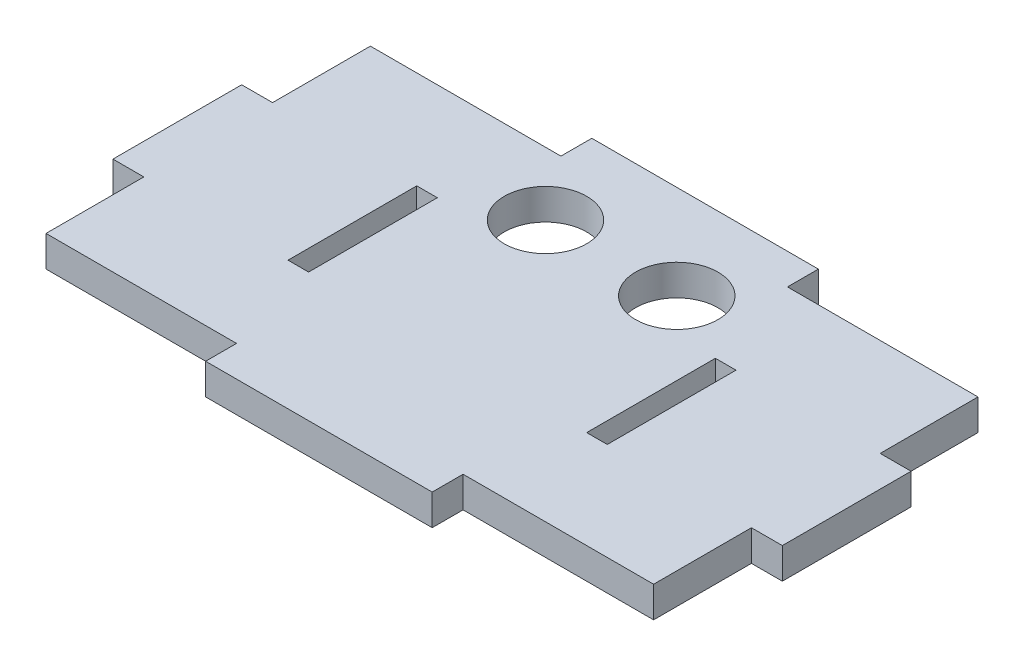
ISO-10303-21;
HEADER;
FILE_DESCRIPTION(('STEP AP214'),'2;1');
FILE_NAME('part.step','',(''),(''),'','','');
FILE_SCHEMA(('AUTOMOTIVE_DESIGN { 1 0 10303 214 1 1 1 1 }'));
ENDSEC;
DATA;
#1=APPLICATION_CONTEXT('core data for automotive mechanical design processes');
#2=APPLICATION_PROTOCOL_DEFINITION('international standard','automotive_design',2000,#1);
#3=PRODUCT_CONTEXT('',#1,'mechanical');
#4=PRODUCT('Part','Part','',(#3));
#5=PRODUCT_RELATED_PRODUCT_CATEGORY('part','',(#4));
#6=PRODUCT_DEFINITION_FORMATION('','',#4);
#7=PRODUCT_DEFINITION_CONTEXT('part definition',#1,'design');
#8=PRODUCT_DEFINITION('design','',#6,#7);
#9=PRODUCT_DEFINITION_SHAPE('','',#8);
#10=(LENGTH_UNIT() NAMED_UNIT(*) SI_UNIT(.MILLI.,.METRE.));
#11=(NAMED_UNIT(*) PLANE_ANGLE_UNIT() SI_UNIT($,.RADIAN.));
#12=(NAMED_UNIT(*) SI_UNIT($,.STERADIAN.) SOLID_ANGLE_UNIT());
#13=UNCERTAINTY_MEASURE_WITH_UNIT(LENGTH_MEASURE(1.E-05),#10,'distance_accuracy_value','');
#14=(GEOMETRIC_REPRESENTATION_CONTEXT(3) GLOBAL_UNCERTAINTY_ASSIGNED_CONTEXT((#13)) GLOBAL_UNIT_ASSIGNED_CONTEXT((#10,
#11,#12)) REPRESENTATION_CONTEXT('',''));
#15=CARTESIAN_POINT('',(0.,0.,0.));
#16=DIRECTION('',(0.,0.,1.));
#17=DIRECTION('',(1.,0.,0.));
#18=AXIS2_PLACEMENT_3D('',#15,#16,#17);
#19=CARTESIAN_POINT('',(0.,6.,0.));
#20=DIRECTION('',(1.,0.,0.));
#21=DIRECTION('',(0.,0.,-1.));
#22=AXIS2_PLACEMENT_3D('',#19,#20,#21);
#23=PLANE('',#22);
#24=DIRECTION('',(0.,1.,0.));
#25=VECTOR('',#24,1.);
#26=CARTESIAN_POINT('',(0.,0.,-25.));
#27=LINE('',#26,#25);
#28=CARTESIAN_POINT('',(0.,0.,-25.));
#29=VERTEX_POINT('',#28);
#30=CARTESIAN_POINT('',(0.,6.,-25.));
#31=VERTEX_POINT('',#30);
#32=EDGE_CURVE('E451',#29,#31,#27,.T.);
#33=ORIENTED_EDGE('',*,*,#32,.T.);
#34=DIRECTION('',(0.,0.,1.));
#35=VECTOR('',#34,1.);
#36=CARTESIAN_POINT('',(0.,6.,0.));
#37=LINE('',#36,#35);
#38=CARTESIAN_POINT('',(0.,6.,-50.));
#39=VERTEX_POINT('',#38);
#40=EDGE_CURVE('E443',#39,#31,#37,.T.);
#41=ORIENTED_EDGE('',*,*,#40,.F.);
#42=DIRECTION('',(0.,1.,0.));
#43=VECTOR('',#42,1.);
#44=CARTESIAN_POINT('',(0.,0.,-50.));
#45=LINE('',#44,#43);
#46=CARTESIAN_POINT('',(0.,0.,-50.));
#47=VERTEX_POINT('',#46);
#48=EDGE_CURVE('E424',#47,#39,#45,.T.);
#49=ORIENTED_EDGE('',*,*,#48,.F.);
#50=DIRECTION('',(0.,0.,1.));
#51=VECTOR('',#50,1.);
#52=CARTESIAN_POINT('',(0.,0.,0.));
#53=LINE('',#52,#51);
#54=EDGE_CURVE('E468',#47,#29,#53,.T.);
#55=ORIENTED_EDGE('',*,*,#54,.T.);
#56=EDGE_LOOP('',(#33,#41,#49,#55));
#57=FACE_BOUND('',#56,.T.);
#58=ADVANCED_FACE('F236',(#57),#23,.F.);
#59=CARTESIAN_POINT('',(0.,6.,0.));
#60=DIRECTION('',(0.,0.,-1.));
#61=DIRECTION('',(-1.,0.,0.));
#62=AXIS2_PLACEMENT_3D('',#59,#60,#61);
#63=PLANE('',#62);
#64=DIRECTION('',(1.,0.,0.));
#65=VECTOR('',#64,1.);
#66=CARTESIAN_POINT('',(0.,6.,0.));
#67=LINE('',#66,#65);
#68=CARTESIAN_POINT('',(43.,6.,0.));
#69=VERTEX_POINT('',#68);
#70=CARTESIAN_POINT('',(87.,6.,0.));
#71=VERTEX_POINT('',#70);
#72=EDGE_CURVE('E453',#69,#71,#67,.T.);
#73=ORIENTED_EDGE('',*,*,#72,.F.);
#74=DIRECTION('',(0.,1.,0.));
#75=VECTOR('',#74,1.);
#76=CARTESIAN_POINT('',(43.,0.,0.));
#77=LINE('',#76,#75);
#78=CARTESIAN_POINT('',(43.,0.,0.));
#79=VERTEX_POINT('',#78);
#80=EDGE_CURVE('E510',#79,#69,#77,.T.);
#81=ORIENTED_EDGE('',*,*,#80,.F.);
#82=DIRECTION('',(1.,0.,0.));
#83=VECTOR('',#82,1.);
#84=CARTESIAN_POINT('',(0.,0.,0.));
#85=LINE('',#84,#83);
#86=CARTESIAN_POINT('',(87.,0.,0.));
#87=VERTEX_POINT('',#86);
#88=EDGE_CURVE('E471',#79,#87,#85,.T.);
#89=ORIENTED_EDGE('',*,*,#88,.T.);
#90=DIRECTION('',(0.,1.,0.));
#91=VECTOR('',#90,1.);
#92=CARTESIAN_POINT('',(87.,0.,0.));
#93=LINE('',#92,#91);
#94=EDGE_CURVE('E598',#87,#71,#93,.T.);
#95=ORIENTED_EDGE('',*,*,#94,.T.);
#96=EDGE_LOOP('',(#73,#81,#89,#95));
#97=FACE_BOUND('',#96,.T.);
#98=ADVANCED_FACE('F690',(#97),#63,.F.);
#99=CARTESIAN_POINT('',(130.,6.,0.));
#100=DIRECTION('',(-1.,0.,0.));
#101=DIRECTION('',(0.,0.,1.));
#102=AXIS2_PLACEMENT_3D('',#99,#100,#101);
#103=PLANE('',#102);
#104=DIRECTION('',(0.,1.,0.));
#105=VECTOR('',#104,1.);
#106=CARTESIAN_POINT('',(130.,0.,-50.));
#107=LINE('',#106,#105);
#108=CARTESIAN_POINT('',(130.,0.,-50.));
#109=VERTEX_POINT('',#108);
#110=CARTESIAN_POINT('',(130.,6.,-50.));
#111=VERTEX_POINT('',#110);
#112=EDGE_CURVE('E483',#109,#111,#107,.T.);
#113=ORIENTED_EDGE('',*,*,#112,.T.);
#114=DIRECTION('',(0.,0.,-1.));
#115=VECTOR('',#114,1.);
#116=CARTESIAN_POINT('',(130.,6.,0.));
#117=LINE('',#116,#115);
#118=CARTESIAN_POINT('',(130.,6.,-25.));
#119=VERTEX_POINT('',#118);
#120=EDGE_CURVE('E245',#119,#111,#117,.T.);
#121=ORIENTED_EDGE('',*,*,#120,.F.);
#122=DIRECTION('',(0.,1.,0.));
#123=VECTOR('',#122,1.);
#124=CARTESIAN_POINT('',(130.,0.,-25.));
#125=LINE('',#124,#123);
#126=CARTESIAN_POINT('',(130.,0.,-25.));
#127=VERTEX_POINT('',#126);
#128=EDGE_CURVE('E484',#127,#119,#125,.T.);
#129=ORIENTED_EDGE('',*,*,#128,.F.);
#130=DIRECTION('',(0.,0.,-1.));
#131=VECTOR('',#130,1.);
#132=CARTESIAN_POINT('',(130.,0.,0.));
#133=LINE('',#132,#131);
#134=EDGE_CURVE('E460',#127,#109,#133,.T.);
#135=ORIENTED_EDGE('',*,*,#134,.T.);
#136=EDGE_LOOP('',(#113,#121,#129,#135));
#137=FACE_BOUND('',#136,.T.);
#138=ADVANCED_FACE('F481',(#137),#103,.F.);
#139=CARTESIAN_POINT('',(0.,6.,-75.));
#140=DIRECTION('',(0.,0.,1.));
#141=DIRECTION('',(1.,0.,0.));
#142=AXIS2_PLACEMENT_3D('',#139,#140,#141);
#143=PLANE('',#142);
#144=DIRECTION('',(0.,1.,0.));
#145=VECTOR('',#144,1.);
#146=CARTESIAN_POINT('',(87.,0.,-75.));
#147=LINE('',#146,#145);
#148=CARTESIAN_POINT('',(87.,0.,-75.));
#149=VERTEX_POINT('',#148);
#150=CARTESIAN_POINT('',(87.,6.,-75.));
#151=VERTEX_POINT('',#150);
#152=EDGE_CURVE('E764',#149,#151,#147,.T.);
#153=ORIENTED_EDGE('',*,*,#152,.F.);
#154=DIRECTION('',(-1.,0.,0.));
#155=VECTOR('',#154,1.);
#156=CARTESIAN_POINT('',(0.,0.,-75.));
#157=LINE('',#156,#155);
#158=CARTESIAN_POINT('',(43.,0.,-75.));
#159=VERTEX_POINT('',#158);
#160=EDGE_CURVE('E239',#149,#159,#157,.T.);
#161=ORIENTED_EDGE('',*,*,#160,.T.);
#162=DIRECTION('',(0.,1.,0.));
#163=VECTOR('',#162,1.);
#164=CARTESIAN_POINT('',(43.,0.,-75.));
#165=LINE('',#164,#163);
#166=CARTESIAN_POINT('',(43.,6.,-75.));
#167=VERTEX_POINT('',#166);
#168=EDGE_CURVE('E818',#159,#167,#165,.T.);
#169=ORIENTED_EDGE('',*,*,#168,.T.);
#170=DIRECTION('',(-1.,0.,0.));
#171=VECTOR('',#170,1.);
#172=CARTESIAN_POINT('',(0.,6.,-75.));
#173=LINE('',#172,#171);
#174=EDGE_CURVE('E12',#151,#167,#173,.T.);
#175=ORIENTED_EDGE('',*,*,#174,.F.);
#176=EDGE_LOOP('',(#153,#161,#169,#175));
#177=FACE_BOUND('',#176,.T.);
#178=ADVANCED_FACE('F659',(#177),#143,.F.);
#179=CARTESIAN_POINT('',(0.,6.,0.));
#180=DIRECTION('',(0.,-1.,0.));
#181=DIRECTION('',(0.,0.,-1.));
#182=AXIS2_PLACEMENT_3D('',#179,#180,#181);
#183=PLANE('',#182);
#184=DIRECTION('',(0.,0.,1.));
#185=VECTOR('',#184,1.);
#186=CARTESIAN_POINT('',(92.,6.,0.));
#187=LINE('',#186,#185);
#188=CARTESIAN_POINT('',(92.,6.,-50.));
#189=VERTEX_POINT('',#188);
#190=CARTESIAN_POINT('',(92.,6.,-25.));
#191=VERTEX_POINT('',#190);
#192=EDGE_CURVE('E794',#189,#191,#187,.T.);
#193=ORIENTED_EDGE('',*,*,#192,.F.);
#194=DIRECTION('',(-1.,0.,0.));
#195=VECTOR('',#194,1.);
#196=CARTESIAN_POINT('',(0.,6.,-50.));
#197=LINE('',#196,#195);
#198=CARTESIAN_POINT('',(96.,6.,-50.));
#199=VERTEX_POINT('',#198);
#200=EDGE_CURVE('E253',#199,#189,#197,.T.);
#201=ORIENTED_EDGE('',*,*,#200,.F.);
#202=DIRECTION('',(0.,0.,1.));
#203=VECTOR('',#202,1.);
#204=CARTESIAN_POINT('',(96.,6.,0.));
#205=LINE('',#204,#203);
#206=CARTESIAN_POINT('',(96.,6.,-25.));
#207=VERTEX_POINT('',#206);
#208=EDGE_CURVE('E779',#199,#207,#205,.T.);
#209=ORIENTED_EDGE('',*,*,#208,.T.);
#210=DIRECTION('',(-1.,0.,0.));
#211=VECTOR('',#210,1.);
#212=CARTESIAN_POINT('',(0.,6.,-25.));
#213=LINE('',#212,#211);
#214=EDGE_CURVE('E798',#207,#191,#213,.T.);
#215=ORIENTED_EDGE('',*,*,#214,.T.);
#216=EDGE_LOOP('',(#193,#201,#209,#215));
#217=FACE_BOUND('',#216,.T.);
#218=CARTESIAN_POINT('',(77.75,6.,-56.75));
#219=DIRECTION('',(0.,1.,0.));
#220=DIRECTION('',(0.,0.,1.));
#221=AXIS2_PLACEMENT_3D('',#218,#219,#220);
#222=CIRCLE('',#221,8.00000000000001);
#223=CARTESIAN_POINT('',(77.75,6.,-48.75));
#224=VERTEX_POINT('',#223);
#225=EDGE_CURVE('E462',#224,#224,#222,.T.);
#226=ORIENTED_EDGE('',*,*,#225,.F.);
#227=EDGE_LOOP('',(#226));
#228=FACE_BOUND('',#227,.T.);
#229=CARTESIAN_POINT('',(52.25,6.,-56.75));
#230=DIRECTION('',(0.,1.,0.));
#231=DIRECTION('',(0.,0.,1.));
#232=AXIS2_PLACEMENT_3D('',#229,#230,#231);
#233=CIRCLE('',#232,8.);
#234=CARTESIAN_POINT('',(52.25,6.,-48.75));
#235=VERTEX_POINT('',#234);
#236=EDGE_CURVE('E643',#235,#235,#233,.T.);
#237=ORIENTED_EDGE('',*,*,#236,.F.);
#238=EDGE_LOOP('',(#237));
#239=FACE_BOUND('',#238,.T.);
#240=DIRECTION('',(0.,0.,1.));
#241=VECTOR('',#240,1.);
#242=CARTESIAN_POINT('',(38.,6.,0.));
#243=LINE('',#242,#241);
#244=CARTESIAN_POINT('',(38.,6.,-50.));
#245=VERTEX_POINT('',#244);
#246=CARTESIAN_POINT('',(38.,6.,-25.));
#247=VERTEX_POINT('',#246);
#248=EDGE_CURVE('E261',#245,#247,#243,.T.);
#249=ORIENTED_EDGE('',*,*,#248,.T.);
#250=DIRECTION('',(1.,0.,0.));
#251=VECTOR('',#250,1.);
#252=CARTESIAN_POINT('',(0.,6.,-25.));
#253=LINE('',#252,#251);
#254=CARTESIAN_POINT('',(34.,6.,-25.));
#255=VERTEX_POINT('',#254);
#256=EDGE_CURVE('E567',#255,#247,#253,.T.);
#257=ORIENTED_EDGE('',*,*,#256,.F.);
#258=DIRECTION('',(0.,0.,1.));
#259=VECTOR('',#258,1.);
#260=CARTESIAN_POINT('',(34.,6.,0.));
#261=LINE('',#260,#259);
#262=CARTESIAN_POINT('',(34.,6.,-50.));
#263=VERTEX_POINT('',#262);
#264=EDGE_CURVE('E571',#263,#255,#261,.T.);
#265=ORIENTED_EDGE('',*,*,#264,.F.);
#266=DIRECTION('',(1.,0.,0.));
#267=VECTOR('',#266,1.);
#268=CARTESIAN_POINT('',(0.,6.,-50.));
#269=LINE('',#268,#267);
#270=EDGE_CURVE('E576',#263,#245,#269,.T.);
#271=ORIENTED_EDGE('',*,*,#270,.T.);
#272=EDGE_LOOP('',(#249,#257,#265,#271));
#273=FACE_BOUND('',#272,.T.);
#274=DIRECTION('',(-1.,0.,0.));
#275=VECTOR('',#274,1.);
#276=CARTESIAN_POINT('',(0.,6.,-50.));
#277=LINE('',#276,#275);
#278=CARTESIAN_POINT('',(124.,6.,-50.));
#279=VERTEX_POINT('',#278);
#280=EDGE_CURVE('E502',#111,#279,#277,.T.);
#281=ORIENTED_EDGE('',*,*,#280,.T.);
#282=DIRECTION('',(0.,0.,1.));
#283=VECTOR('',#282,1.);
#284=CARTESIAN_POINT('',(124.,6.,0.));
#285=LINE('',#284,#283);
#286=CARTESIAN_POINT('',(124.,6.,-69.));
#287=VERTEX_POINT('',#286);
#288=EDGE_CURVE('E507',#287,#279,#285,.T.);
#289=ORIENTED_EDGE('',*,*,#288,.F.);
#290=DIRECTION('',(1.,0.,0.));
#291=VECTOR('',#290,1.);
#292=CARTESIAN_POINT('',(87.,6.,-69.));
#293=LINE('',#292,#291);
#294=CARTESIAN_POINT('',(87.,6.,-69.));
#295=VERTEX_POINT('',#294);
#296=EDGE_CURVE('E632',#295,#287,#293,.T.);
#297=ORIENTED_EDGE('',*,*,#296,.F.);
#298=DIRECTION('',(0.,0.,-1.));
#299=VECTOR('',#298,1.);
#300=CARTESIAN_POINT('',(87.,6.,-69.));
#301=LINE('',#300,#299);
#302=EDGE_CURVE('E760',#295,#151,#301,.T.);
#303=ORIENTED_EDGE('',*,*,#302,.T.);
#304=ORIENTED_EDGE('',*,*,#174,.T.);
#305=DIRECTION('',(0.,0.,1.));
#306=VECTOR('',#305,1.);
#307=CARTESIAN_POINT('',(43.,6.,-75.));
#308=LINE('',#307,#306);
#309=CARTESIAN_POINT('',(43.,6.,-69.));
#310=VERTEX_POINT('',#309);
#311=EDGE_CURVE('E823',#167,#310,#308,.T.);
#312=ORIENTED_EDGE('',*,*,#311,.T.);
#313=DIRECTION('',(1.,0.,0.));
#314=VECTOR('',#313,1.);
#315=CARTESIAN_POINT('',(0.,6.,-69.));
#316=LINE('',#315,#314);
#317=CARTESIAN_POINT('',(6.,6.,-69.));
#318=VERTEX_POINT('',#317);
#319=EDGE_CURVE('E829',#318,#310,#316,.T.);
#320=ORIENTED_EDGE('',*,*,#319,.F.);
#321=DIRECTION('',(0.,0.,-1.));
#322=VECTOR('',#321,1.);
#323=CARTESIAN_POINT('',(6.,6.,-50.));
#324=LINE('',#323,#322);
#325=CARTESIAN_POINT('',(6.,6.,-50.));
#326=VERTEX_POINT('',#325);
#327=EDGE_CURVE('E446',#326,#318,#324,.T.);
#328=ORIENTED_EDGE('',*,*,#327,.F.);
#329=DIRECTION('',(1.,0.,0.));
#330=VECTOR('',#329,1.);
#331=CARTESIAN_POINT('',(0.,6.,-50.));
#332=LINE('',#331,#330);
#333=EDGE_CURVE('E427',#39,#326,#332,.T.);
#334=ORIENTED_EDGE('',*,*,#333,.F.);
#335=ORIENTED_EDGE('',*,*,#40,.T.);
#336=DIRECTION('',(1.,0.,0.));
#337=VECTOR('',#336,1.);
#338=CARTESIAN_POINT('',(0.,6.,-25.));
#339=LINE('',#338,#337);
#340=CARTESIAN_POINT('',(6.,6.,-25.));
#341=VERTEX_POINT('',#340);
#342=EDGE_CURVE('E525',#31,#341,#339,.T.);
#343=ORIENTED_EDGE('',*,*,#342,.T.);
#344=DIRECTION('',(0.,0.,-1.));
#345=VECTOR('',#344,1.);
#346=CARTESIAN_POINT('',(6.,6.,0.));
#347=LINE('',#346,#345);
#348=CARTESIAN_POINT('',(6.,6.,-6.));
#349=VERTEX_POINT('',#348);
#350=EDGE_CURVE('E528',#349,#341,#347,.T.);
#351=ORIENTED_EDGE('',*,*,#350,.F.);
#352=DIRECTION('',(1.,0.,0.));
#353=VECTOR('',#352,1.);
#354=CARTESIAN_POINT('',(0.,6.,-6.));
#355=LINE('',#354,#353);
#356=CARTESIAN_POINT('',(43.,6.,-6.));
#357=VERTEX_POINT('',#356);
#358=EDGE_CURVE('E533',#349,#357,#355,.T.);
#359=ORIENTED_EDGE('',*,*,#358,.T.);
#360=DIRECTION('',(0.,0.,-1.));
#361=VECTOR('',#360,1.);
#362=CARTESIAN_POINT('',(43.,6.,0.));
#363=LINE('',#362,#361);
#364=EDGE_CURVE('E537',#69,#357,#363,.T.);
#365=ORIENTED_EDGE('',*,*,#364,.F.);
#366=ORIENTED_EDGE('',*,*,#72,.T.);
#367=DIRECTION('',(0.,0.,-1.));
#368=VECTOR('',#367,1.);
#369=CARTESIAN_POINT('',(87.,6.,0.));
#370=LINE('',#369,#368);
#371=CARTESIAN_POINT('',(87.,6.,-6.));
#372=VERTEX_POINT('',#371);
#373=EDGE_CURVE('E604',#71,#372,#370,.T.);
#374=ORIENTED_EDGE('',*,*,#373,.T.);
#375=DIRECTION('',(-1.,0.,0.));
#376=VECTOR('',#375,1.);
#377=CARTESIAN_POINT('',(130.,6.,-6.));
#378=LINE('',#377,#376);
#379=CARTESIAN_POINT('',(124.,6.,-6.));
#380=VERTEX_POINT('',#379);
#381=EDGE_CURVE('E609',#380,#372,#378,.T.);
#382=ORIENTED_EDGE('',*,*,#381,.F.);
#383=DIRECTION('',(0.,0.,1.));
#384=VECTOR('',#383,1.);
#385=CARTESIAN_POINT('',(124.,6.,-25.));
#386=LINE('',#385,#384);
#387=CARTESIAN_POINT('',(124.,6.,-25.));
#388=VERTEX_POINT('',#387);
#389=EDGE_CURVE('E628',#388,#380,#386,.T.);
#390=ORIENTED_EDGE('',*,*,#389,.F.);
#391=DIRECTION('',(-1.,0.,0.));
#392=VECTOR('',#391,1.);
#393=CARTESIAN_POINT('',(130.,6.,-25.));
#394=LINE('',#393,#392);
#395=EDGE_CURVE('E625',#119,#388,#394,.T.);
#396=ORIENTED_EDGE('',*,*,#395,.F.);
#397=ORIENTED_EDGE('',*,*,#120,.T.);
#398=EDGE_LOOP('',(#281,#289,#297,#303,#304,#312,#320,#328,#334,#335,#343,#351,#359,#365,#366,
#374,#382,#390,#396,#397));
#399=FACE_BOUND('',#398,.T.);
#400=ADVANCED_FACE('F441',(#217,#228,#239,#273,#399),#183,.F.);
#401=CARTESIAN_POINT('',(0.,0.,0.));
#402=DIRECTION('',(0.,-1.,0.));
#403=DIRECTION('',(0.,0.,-1.));
#404=AXIS2_PLACEMENT_3D('',#401,#402,#403);
#405=PLANE('',#404);
#406=DIRECTION('',(-1.,0.,0.));
#407=VECTOR('',#406,1.);
#408=CARTESIAN_POINT('',(0.,0.,-50.));
#409=LINE('',#408,#407);
#410=CARTESIAN_POINT('',(96.,0.,-50.));
#411=VERTEX_POINT('',#410);
#412=CARTESIAN_POINT('',(92.,0.,-50.));
#413=VERTEX_POINT('',#412);
#414=EDGE_CURVE('E775',#411,#413,#409,.T.);
#415=ORIENTED_EDGE('',*,*,#414,.T.);
#416=DIRECTION('',(0.,0.,1.));
#417=VECTOR('',#416,1.);
#418=CARTESIAN_POINT('',(92.,0.,0.));
#419=LINE('',#418,#417);
#420=CARTESIAN_POINT('',(92.,0.,-25.));
#421=VERTEX_POINT('',#420);
#422=EDGE_CURVE('E780',#413,#421,#419,.T.);
#423=ORIENTED_EDGE('',*,*,#422,.T.);
#424=DIRECTION('',(-1.,0.,0.));
#425=VECTOR('',#424,1.);
#426=CARTESIAN_POINT('',(0.,0.,-25.));
#427=LINE('',#426,#425);
#428=CARTESIAN_POINT('',(96.,0.,-25.));
#429=VERTEX_POINT('',#428);
#430=EDGE_CURVE('E784',#429,#421,#427,.T.);
#431=ORIENTED_EDGE('',*,*,#430,.F.);
#432=DIRECTION('',(0.,0.,1.));
#433=VECTOR('',#432,1.);
#434=CARTESIAN_POINT('',(96.,0.,0.));
#435=LINE('',#434,#433);
#436=EDGE_CURVE('E788',#411,#429,#435,.T.);
#437=ORIENTED_EDGE('',*,*,#436,.F.);
#438=EDGE_LOOP('',(#415,#423,#431,#437));
#439=FACE_BOUND('',#438,.T.);
#440=CARTESIAN_POINT('',(52.25,0.,-56.75));
#441=DIRECTION('',(0.,1.,0.));
#442=DIRECTION('',(0.,0.,1.));
#443=AXIS2_PLACEMENT_3D('',#440,#441,#442);
#444=CIRCLE('',#443,8.);
#445=CARTESIAN_POINT('',(52.25,0.,-48.75));
#446=VERTEX_POINT('',#445);
#447=EDGE_CURVE('E472',#446,#446,#444,.T.);
#448=ORIENTED_EDGE('',*,*,#447,.T.);
#449=EDGE_LOOP('',(#448));
#450=FACE_BOUND('',#449,.T.);
#451=CARTESIAN_POINT('',(77.75,0.,-56.75));
#452=DIRECTION('',(0.,1.,0.));
#453=DIRECTION('',(0.,0.,1.));
#454=AXIS2_PLACEMENT_3D('',#451,#452,#453);
#455=CIRCLE('',#454,8.00000000000001);
#456=CARTESIAN_POINT('',(77.75,0.,-48.75));
#457=VERTEX_POINT('',#456);
#458=EDGE_CURVE('E646',#457,#457,#455,.T.);
#459=ORIENTED_EDGE('',*,*,#458,.T.);
#460=EDGE_LOOP('',(#459));
#461=FACE_BOUND('',#460,.T.);
#462=DIRECTION('',(1.,0.,0.));
#463=VECTOR('',#462,1.);
#464=CARTESIAN_POINT('',(0.,0.,-25.));
#465=LINE('',#464,#463);
#466=CARTESIAN_POINT('',(34.,0.,-25.));
#467=VERTEX_POINT('',#466);
#468=CARTESIAN_POINT('',(38.,0.,-25.));
#469=VERTEX_POINT('',#468);
#470=EDGE_CURVE('E558',#467,#469,#465,.T.);
#471=ORIENTED_EDGE('',*,*,#470,.T.);
#472=DIRECTION('',(0.,0.,1.));
#473=VECTOR('',#472,1.);
#474=CARTESIAN_POINT('',(38.,0.,0.));
#475=LINE('',#474,#473);
#476=CARTESIAN_POINT('',(38.,0.,-50.));
#477=VERTEX_POINT('',#476);
#478=EDGE_CURVE('E572',#477,#469,#475,.T.);
#479=ORIENTED_EDGE('',*,*,#478,.F.);
#480=DIRECTION('',(1.,0.,0.));
#481=VECTOR('',#480,1.);
#482=CARTESIAN_POINT('',(0.,0.,-50.));
#483=LINE('',#482,#481);
#484=CARTESIAN_POINT('',(34.,0.,-50.));
#485=VERTEX_POINT('',#484);
#486=EDGE_CURVE('E590',#485,#477,#483,.T.);
#487=ORIENTED_EDGE('',*,*,#486,.F.);
#488=DIRECTION('',(0.,0.,1.));
#489=VECTOR('',#488,1.);
#490=CARTESIAN_POINT('',(34.,0.,0.));
#491=LINE('',#490,#489);
#492=EDGE_CURVE('E586',#485,#467,#491,.T.);
#493=ORIENTED_EDGE('',*,*,#492,.T.);
#494=EDGE_LOOP('',(#471,#479,#487,#493));
#495=FACE_BOUND('',#494,.T.);
#496=DIRECTION('',(0.,0.,1.));
#497=VECTOR('',#496,1.);
#498=CARTESIAN_POINT('',(124.,0.,0.));
#499=LINE('',#498,#497);
#500=CARTESIAN_POINT('',(124.,0.,-69.));
#501=VERTEX_POINT('',#500);
#502=CARTESIAN_POINT('',(124.,0.,-50.));
#503=VERTEX_POINT('',#502);
#504=EDGE_CURVE('E494',#501,#503,#499,.T.);
#505=ORIENTED_EDGE('',*,*,#504,.T.);
#506=DIRECTION('',(-1.,0.,0.));
#507=VECTOR('',#506,1.);
#508=CARTESIAN_POINT('',(0.,0.,-50.));
#509=LINE('',#508,#507);
#510=EDGE_CURVE('E492',#109,#503,#509,.T.);
#511=ORIENTED_EDGE('',*,*,#510,.F.);
#512=ORIENTED_EDGE('',*,*,#134,.F.);
#513=DIRECTION('',(-1.,0.,0.));
#514=VECTOR('',#513,1.);
#515=CARTESIAN_POINT('',(130.,0.,-25.));
#516=LINE('',#515,#514);
#517=CARTESIAN_POINT('',(124.,0.,-25.));
#518=VERTEX_POINT('',#517);
#519=EDGE_CURVE('E491',#127,#518,#516,.T.);
#520=ORIENTED_EDGE('',*,*,#519,.T.);
#521=DIRECTION('',(0.,0.,1.));
#522=VECTOR('',#521,1.);
#523=CARTESIAN_POINT('',(124.,0.,-25.));
#524=LINE('',#523,#522);
#525=CARTESIAN_POINT('',(124.,0.,-6.));
#526=VERTEX_POINT('',#525);
#527=EDGE_CURVE('E622',#518,#526,#524,.T.);
#528=ORIENTED_EDGE('',*,*,#527,.T.);
#529=DIRECTION('',(-1.,0.,0.));
#530=VECTOR('',#529,1.);
#531=CARTESIAN_POINT('',(130.,0.,-6.));
#532=LINE('',#531,#530);
#533=CARTESIAN_POINT('',(87.,0.,-6.));
#534=VERTEX_POINT('',#533);
#535=EDGE_CURVE('E599',#526,#534,#532,.T.);
#536=ORIENTED_EDGE('',*,*,#535,.T.);
#537=DIRECTION('',(0.,0.,-1.));
#538=VECTOR('',#537,1.);
#539=CARTESIAN_POINT('',(87.,0.,0.));
#540=LINE('',#539,#538);
#541=EDGE_CURVE('E603',#87,#534,#540,.T.);
#542=ORIENTED_EDGE('',*,*,#541,.F.);
#543=ORIENTED_EDGE('',*,*,#88,.F.);
#544=DIRECTION('',(0.,0.,-1.));
#545=VECTOR('',#544,1.);
#546=CARTESIAN_POINT('',(43.,0.,0.));
#547=LINE('',#546,#545);
#548=CARTESIAN_POINT('',(43.,0.,-6.));
#549=VERTEX_POINT('',#548);
#550=EDGE_CURVE('E529',#79,#549,#547,.T.);
#551=ORIENTED_EDGE('',*,*,#550,.T.);
#552=DIRECTION('',(1.,0.,0.));
#553=VECTOR('',#552,1.);
#554=CARTESIAN_POINT('',(0.,0.,-6.));
#555=LINE('',#554,#553);
#556=CARTESIAN_POINT('',(6.,0.,-6.));
#557=VERTEX_POINT('',#556);
#558=EDGE_CURVE('E548',#557,#549,#555,.T.);
#559=ORIENTED_EDGE('',*,*,#558,.F.);
#560=DIRECTION('',(0.,0.,-1.));
#561=VECTOR('',#560,1.);
#562=CARTESIAN_POINT('',(6.,0.,0.));
#563=LINE('',#562,#561);
#564=CARTESIAN_POINT('',(6.,0.,-25.));
#565=VERTEX_POINT('',#564);
#566=EDGE_CURVE('E544',#557,#565,#563,.T.);
#567=ORIENTED_EDGE('',*,*,#566,.T.);
#568=DIRECTION('',(1.,0.,0.));
#569=VECTOR('',#568,1.);
#570=CARTESIAN_POINT('',(0.,0.,-25.));
#571=LINE('',#570,#569);
#572=EDGE_CURVE('E513',#29,#565,#571,.T.);
#573=ORIENTED_EDGE('',*,*,#572,.F.);
#574=ORIENTED_EDGE('',*,*,#54,.F.);
#575=DIRECTION('',(1.,0.,0.));
#576=VECTOR('',#575,1.);
#577=CARTESIAN_POINT('',(0.,0.,-50.));
#578=LINE('',#577,#576);
#579=CARTESIAN_POINT('',(6.,0.,-50.));
#580=VERTEX_POINT('',#579);
#581=EDGE_CURVE('E430',#47,#580,#578,.T.);
#582=ORIENTED_EDGE('',*,*,#581,.T.);
#583=DIRECTION('',(0.,0.,-1.));
#584=VECTOR('',#583,1.);
#585=CARTESIAN_POINT('',(6.,0.,-50.));
#586=LINE('',#585,#584);
#587=CARTESIAN_POINT('',(6.,0.,-69.));
#588=VERTEX_POINT('',#587);
#589=EDGE_CURVE('E448',#580,#588,#586,.T.);
#590=ORIENTED_EDGE('',*,*,#589,.T.);
#591=DIRECTION('',(1.,0.,0.));
#592=VECTOR('',#591,1.);
#593=CARTESIAN_POINT('',(0.,0.,-69.));
#594=LINE('',#593,#592);
#595=CARTESIAN_POINT('',(43.,0.,-69.));
#596=VERTEX_POINT('',#595);
#597=EDGE_CURVE('E819',#588,#596,#594,.T.);
#598=ORIENTED_EDGE('',*,*,#597,.T.);
#599=DIRECTION('',(0.,0.,1.));
#600=VECTOR('',#599,1.);
#601=CARTESIAN_POINT('',(43.,0.,-75.));
#602=LINE('',#601,#600);
#603=EDGE_CURVE('E824',#159,#596,#602,.T.);
#604=ORIENTED_EDGE('',*,*,#603,.F.);
#605=ORIENTED_EDGE('',*,*,#160,.F.);
#606=DIRECTION('',(0.,0.,-1.));
#607=VECTOR('',#606,1.);
#608=CARTESIAN_POINT('',(87.,0.,-69.));
#609=LINE('',#608,#607);
#610=CARTESIAN_POINT('',(87.,0.,-69.));
#611=VERTEX_POINT('',#610);
#612=EDGE_CURVE('E761',#611,#149,#609,.T.);
#613=ORIENTED_EDGE('',*,*,#612,.F.);
#614=DIRECTION('',(1.,0.,0.));
#615=VECTOR('',#614,1.);
#616=CARTESIAN_POINT('',(87.,0.,-69.));
#617=LINE('',#616,#615);
#618=EDGE_CURVE('E757',#611,#501,#617,.T.);
#619=ORIENTED_EDGE('',*,*,#618,.T.);
#620=EDGE_LOOP('',(#505,#511,#512,#520,#528,#536,#542,#543,#551,#559,#567,#573,#574,#582,#590,
#598,#604,#605,#613,#619));
#621=FACE_BOUND('',#620,.T.);
#622=ADVANCED_FACE('F489',(#439,#450,#461,#495,#621),#405,.T.);
#623=CARTESIAN_POINT('',(77.75,0.,-56.75));
#624=DIRECTION('',(0.,1.,0.));
#625=DIRECTION('',(0.,0.,1.));
#626=AXIS2_PLACEMENT_3D('',#623,#624,#625);
#627=CYLINDRICAL_SURFACE('',#626,8.00000000000001);
#628=ORIENTED_EDGE('',*,*,#458,.F.);
#629=EDGE_LOOP('',(#628));
#630=FACE_BOUND('',#629,.T.);
#631=ORIENTED_EDGE('',*,*,#225,.T.);
#632=EDGE_LOOP('',(#631));
#633=FACE_BOUND('',#632,.T.);
#634=ADVANCED_FACE('F655',(#630,#633),#627,.F.);
#635=CARTESIAN_POINT('',(52.25,0.,-56.75));
#636=DIRECTION('',(0.,1.,0.));
#637=DIRECTION('',(0.,0.,1.));
#638=AXIS2_PLACEMENT_3D('',#635,#636,#637);
#639=CYLINDRICAL_SURFACE('',#638,8.);
#640=ORIENTED_EDGE('',*,*,#447,.F.);
#641=EDGE_LOOP('',(#640));
#642=FACE_BOUND('',#641,.T.);
#643=ORIENTED_EDGE('',*,*,#236,.T.);
#644=EDGE_LOOP('',(#643));
#645=FACE_BOUND('',#644,.T.);
#646=ADVANCED_FACE('F709',(#642,#645),#639,.F.);
#647=CARTESIAN_POINT('',(124.,0.,-25.));
#648=DIRECTION('',(-1.,0.,0.));
#649=DIRECTION('',(0.,0.,1.));
#650=AXIS2_PLACEMENT_3D('',#647,#648,#649);
#651=PLANE('',#650);
#652=ORIENTED_EDGE('',*,*,#527,.F.);
#653=DIRECTION('',(0.,1.,0.));
#654=VECTOR('',#653,1.);
#655=CARTESIAN_POINT('',(124.,0.,-25.));
#656=LINE('',#655,#654);
#657=EDGE_CURVE('E612',#518,#388,#656,.T.);
#658=ORIENTED_EDGE('',*,*,#657,.T.);
#659=ORIENTED_EDGE('',*,*,#389,.T.);
#660=DIRECTION('',(0.,1.,0.));
#661=VECTOR('',#660,1.);
#662=CARTESIAN_POINT('',(124.,0.,-6.));
#663=LINE('',#662,#661);
#664=EDGE_CURVE('E595',#526,#380,#663,.T.);
#665=ORIENTED_EDGE('',*,*,#664,.F.);
#666=EDGE_LOOP('',(#652,#658,#659,#665));
#667=FACE_BOUND('',#666,.T.);
#668=ADVANCED_FACE('F713',(#667),#651,.F.);
#669=CARTESIAN_POINT('',(130.,0.,-25.));
#670=DIRECTION('',(0.,0.,-1.));
#671=DIRECTION('',(-1.,0.,0.));
#672=AXIS2_PLACEMENT_3D('',#669,#670,#671);
#673=PLANE('',#672);
#674=ORIENTED_EDGE('',*,*,#395,.T.);
#675=ORIENTED_EDGE('',*,*,#657,.F.);
#676=ORIENTED_EDGE('',*,*,#519,.F.);
#677=ORIENTED_EDGE('',*,*,#128,.T.);
#678=EDGE_LOOP('',(#674,#675,#676,#677));
#679=FACE_BOUND('',#678,.T.);
#680=ADVANCED_FACE('F717',(#679),#673,.F.);
#681=CARTESIAN_POINT('',(87.,0.,0.));
#682=DIRECTION('',(1.,0.,0.));
#683=DIRECTION('',(0.,0.,-1.));
#684=AXIS2_PLACEMENT_3D('',#681,#682,#683);
#685=PLANE('',#684);
#686=ORIENTED_EDGE('',*,*,#373,.F.);
#687=ORIENTED_EDGE('',*,*,#94,.F.);
#688=ORIENTED_EDGE('',*,*,#541,.T.);
#689=DIRECTION('',(0.,1.,0.));
#690=VECTOR('',#689,1.);
#691=CARTESIAN_POINT('',(87.,0.,-6.));
#692=LINE('',#691,#690);
#693=EDGE_CURVE('E608',#534,#372,#692,.T.);
#694=ORIENTED_EDGE('',*,*,#693,.T.);
#695=EDGE_LOOP('',(#686,#687,#688,#694));
#696=FACE_BOUND('',#695,.T.);
#697=ADVANCED_FACE('F721',(#696),#685,.T.);
#698=CARTESIAN_POINT('',(130.,0.,-6.));
#699=DIRECTION('',(0.,0.,-1.));
#700=DIRECTION('',(-1.,0.,0.));
#701=AXIS2_PLACEMENT_3D('',#698,#699,#700);
#702=PLANE('',#701);
#703=ORIENTED_EDGE('',*,*,#664,.T.);
#704=ORIENTED_EDGE('',*,*,#381,.T.);
#705=ORIENTED_EDGE('',*,*,#693,.F.);
#706=ORIENTED_EDGE('',*,*,#535,.F.);
#707=EDGE_LOOP('',(#703,#704,#705,#706));
#708=FACE_BOUND('',#707,.T.);
#709=ADVANCED_FACE('F723',(#708),#702,.F.);
#710=CARTESIAN_POINT('',(6.,0.,-50.));
#711=DIRECTION('',(1.,0.,0.));
#712=DIRECTION('',(0.,0.,-1.));
#713=AXIS2_PLACEMENT_3D('',#710,#711,#712);
#714=PLANE('',#713);
#715=ORIENTED_EDGE('',*,*,#589,.F.);
#716=DIRECTION('',(0.,1.,0.));
#717=VECTOR('',#716,1.);
#718=CARTESIAN_POINT('',(6.,0.,-50.));
#719=LINE('',#718,#717);
#720=EDGE_CURVE('E436',#580,#326,#719,.T.);
#721=ORIENTED_EDGE('',*,*,#720,.T.);
#722=ORIENTED_EDGE('',*,*,#327,.T.);
#723=DIRECTION('',(0.,1.,0.));
#724=VECTOR('',#723,1.);
#725=CARTESIAN_POINT('',(6.,0.,-69.));
#726=LINE('',#725,#724);
#727=EDGE_CURVE('E815',#588,#318,#726,.T.);
#728=ORIENTED_EDGE('',*,*,#727,.F.);
#729=EDGE_LOOP('',(#715,#721,#722,#728));
#730=FACE_BOUND('',#729,.T.);
#731=ADVANCED_FACE('F726',(#730),#714,.F.);
#732=CARTESIAN_POINT('',(0.,0.,-50.));
#733=DIRECTION('',(0.,0.,1.));
#734=DIRECTION('',(1.,0.,0.));
#735=AXIS2_PLACEMENT_3D('',#732,#733,#734);
#736=PLANE('',#735);
#737=ORIENTED_EDGE('',*,*,#333,.T.);
#738=ORIENTED_EDGE('',*,*,#720,.F.);
#739=ORIENTED_EDGE('',*,*,#581,.F.);
#740=ORIENTED_EDGE('',*,*,#48,.T.);
#741=EDGE_LOOP('',(#737,#738,#739,#740));
#742=FACE_BOUND('',#741,.T.);
#743=ADVANCED_FACE('F426',(#742),#736,.F.);
#744=CARTESIAN_POINT('',(43.,0.,-75.));
#745=DIRECTION('',(-1.,0.,0.));
#746=DIRECTION('',(0.,0.,1.));
#747=AXIS2_PLACEMENT_3D('',#744,#745,#746);
#748=PLANE('',#747);
#749=ORIENTED_EDGE('',*,*,#311,.F.);
#750=ORIENTED_EDGE('',*,*,#168,.F.);
#751=ORIENTED_EDGE('',*,*,#603,.T.);
#752=DIRECTION('',(0.,1.,0.));
#753=VECTOR('',#752,1.);
#754=CARTESIAN_POINT('',(43.,0.,-69.));
#755=LINE('',#754,#753);
#756=EDGE_CURVE('E828',#596,#310,#755,.T.);
#757=ORIENTED_EDGE('',*,*,#756,.T.);
#758=EDGE_LOOP('',(#749,#750,#751,#757));
#759=FACE_BOUND('',#758,.T.);
#760=ADVANCED_FACE('F879',(#759),#748,.T.);
#761=CARTESIAN_POINT('',(0.,0.,-69.));
#762=DIRECTION('',(0.,0.,1.));
#763=DIRECTION('',(1.,0.,0.));
#764=AXIS2_PLACEMENT_3D('',#761,#762,#763);
#765=PLANE('',#764);
#766=ORIENTED_EDGE('',*,*,#727,.T.);
#767=ORIENTED_EDGE('',*,*,#319,.T.);
#768=ORIENTED_EDGE('',*,*,#756,.F.);
#769=ORIENTED_EDGE('',*,*,#597,.F.);
#770=EDGE_LOOP('',(#766,#767,#768,#769));
#771=FACE_BOUND('',#770,.T.);
#772=ADVANCED_FACE('F875',(#771),#765,.F.);
#773=CARTESIAN_POINT('',(38.,0.,0.));
#774=DIRECTION('',(-1.,0.,0.));
#775=DIRECTION('',(0.,0.,1.));
#776=AXIS2_PLACEMENT_3D('',#773,#774,#775);
#777=PLANE('',#776);
#778=ORIENTED_EDGE('',*,*,#248,.F.);
#779=DIRECTION('',(0.,1.,0.));
#780=VECTOR('',#779,1.);
#781=CARTESIAN_POINT('',(38.,0.,-50.));
#782=LINE('',#781,#780);
#783=EDGE_CURVE('E555',#477,#245,#782,.T.);
#784=ORIENTED_EDGE('',*,*,#783,.F.);
#785=ORIENTED_EDGE('',*,*,#478,.T.);
#786=DIRECTION('',(0.,1.,0.));
#787=VECTOR('',#786,1.);
#788=CARTESIAN_POINT('',(38.,0.,-25.));
#789=LINE('',#788,#787);
#790=EDGE_CURVE('E541',#469,#247,#789,.T.);
#791=ORIENTED_EDGE('',*,*,#790,.T.);
#792=EDGE_LOOP('',(#778,#784,#785,#791));
#793=FACE_BOUND('',#792,.T.);
#794=ADVANCED_FACE('F672',(#793),#777,.T.);
#795=CARTESIAN_POINT('',(0.,0.,-25.));
#796=DIRECTION('',(0.,0.,1.));
#797=DIRECTION('',(1.,0.,0.));
#798=AXIS2_PLACEMENT_3D('',#795,#796,#797);
#799=PLANE('',#798);
#800=ORIENTED_EDGE('',*,*,#256,.T.);
#801=ORIENTED_EDGE('',*,*,#790,.F.);
#802=ORIENTED_EDGE('',*,*,#470,.F.);
#803=DIRECTION('',(0.,1.,0.));
#804=VECTOR('',#803,1.);
#805=CARTESIAN_POINT('',(34.,0.,-25.));
#806=LINE('',#805,#804);
#807=EDGE_CURVE('E562',#467,#255,#806,.T.);
#808=ORIENTED_EDGE('',*,*,#807,.T.);
#809=EDGE_LOOP('',(#800,#801,#802,#808));
#810=FACE_BOUND('',#809,.T.);
#811=ADVANCED_FACE('F677',(#810),#799,.F.);
#812=CARTESIAN_POINT('',(34.,0.,0.));
#813=DIRECTION('',(-1.,0.,0.));
#814=DIRECTION('',(0.,0.,1.));
#815=AXIS2_PLACEMENT_3D('',#812,#813,#814);
#816=PLANE('',#815);
#817=ORIENTED_EDGE('',*,*,#264,.T.);
#818=ORIENTED_EDGE('',*,*,#807,.F.);
#819=ORIENTED_EDGE('',*,*,#492,.F.);
#820=DIRECTION('',(0.,1.,0.));
#821=VECTOR('',#820,1.);
#822=CARTESIAN_POINT('',(34.,0.,-50.));
#823=LINE('',#822,#821);
#824=EDGE_CURVE('E559',#485,#263,#823,.T.);
#825=ORIENTED_EDGE('',*,*,#824,.T.);
#826=EDGE_LOOP('',(#817,#818,#819,#825));
#827=FACE_BOUND('',#826,.T.);
#828=ADVANCED_FACE('F679',(#827),#816,.F.);
#829=CARTESIAN_POINT('',(0.,0.,-50.));
#830=DIRECTION('',(0.,0.,1.));
#831=DIRECTION('',(1.,0.,0.));
#832=AXIS2_PLACEMENT_3D('',#829,#830,#831);
#833=PLANE('',#832);
#834=ORIENTED_EDGE('',*,*,#270,.F.);
#835=ORIENTED_EDGE('',*,*,#824,.F.);
#836=ORIENTED_EDGE('',*,*,#486,.T.);
#837=ORIENTED_EDGE('',*,*,#783,.T.);
#838=EDGE_LOOP('',(#834,#835,#836,#837));
#839=FACE_BOUND('',#838,.T.);
#840=ADVANCED_FACE('F669',(#839),#833,.T.);
#841=CARTESIAN_POINT('',(0.,0.,-25.));
#842=DIRECTION('',(0.,0.,1.));
#843=DIRECTION('',(1.,0.,0.));
#844=AXIS2_PLACEMENT_3D('',#841,#842,#843);
#845=PLANE('',#844);
#846=ORIENTED_EDGE('',*,*,#342,.F.);
#847=ORIENTED_EDGE('',*,*,#32,.F.);
#848=ORIENTED_EDGE('',*,*,#572,.T.);
#849=DIRECTION('',(0.,1.,0.));
#850=VECTOR('',#849,1.);
#851=CARTESIAN_POINT('',(6.,0.,-25.));
#852=LINE('',#851,#850);
#853=EDGE_CURVE('E520',#565,#341,#852,.T.);
#854=ORIENTED_EDGE('',*,*,#853,.T.);
#855=EDGE_LOOP('',(#846,#847,#848,#854));
#856=FACE_BOUND('',#855,.T.);
#857=ADVANCED_FACE('F686',(#856),#845,.T.);
#858=CARTESIAN_POINT('',(6.,0.,0.));
#859=DIRECTION('',(1.,0.,0.));
#860=DIRECTION('',(0.,0.,-1.));
#861=AXIS2_PLACEMENT_3D('',#858,#859,#860);
#862=PLANE('',#861);
#863=ORIENTED_EDGE('',*,*,#350,.T.);
#864=ORIENTED_EDGE('',*,*,#853,.F.);
#865=ORIENTED_EDGE('',*,*,#566,.F.);
#866=DIRECTION('',(0.,1.,0.));
#867=VECTOR('',#866,1.);
#868=CARTESIAN_POINT('',(6.,0.,-6.));
#869=LINE('',#868,#867);
#870=EDGE_CURVE('E517',#557,#349,#869,.T.);
#871=ORIENTED_EDGE('',*,*,#870,.T.);
#872=EDGE_LOOP('',(#863,#864,#865,#871));
#873=FACE_BOUND('',#872,.T.);
#874=ADVANCED_FACE('F857',(#873),#862,.F.);
#875=CARTESIAN_POINT('',(0.,0.,-6.));
#876=DIRECTION('',(0.,0.,1.));
#877=DIRECTION('',(1.,0.,0.));
#878=AXIS2_PLACEMENT_3D('',#875,#876,#877);
#879=PLANE('',#878);
#880=ORIENTED_EDGE('',*,*,#358,.F.);
#881=ORIENTED_EDGE('',*,*,#870,.F.);
#882=ORIENTED_EDGE('',*,*,#558,.T.);
#883=DIRECTION('',(0.,1.,0.));
#884=VECTOR('',#883,1.);
#885=CARTESIAN_POINT('',(43.,0.,-6.));
#886=LINE('',#885,#884);
#887=EDGE_CURVE('E514',#549,#357,#886,.T.);
#888=ORIENTED_EDGE('',*,*,#887,.T.);
#889=EDGE_LOOP('',(#880,#881,#882,#888));
#890=FACE_BOUND('',#889,.T.);
#891=ADVANCED_FACE('F859',(#890),#879,.T.);
#892=CARTESIAN_POINT('',(43.,0.,0.));
#893=DIRECTION('',(1.,0.,0.));
#894=DIRECTION('',(0.,0.,-1.));
#895=AXIS2_PLACEMENT_3D('',#892,#893,#894);
#896=PLANE('',#895);
#897=ORIENTED_EDGE('',*,*,#364,.T.);
#898=ORIENTED_EDGE('',*,*,#887,.F.);
#899=ORIENTED_EDGE('',*,*,#550,.F.);
#900=ORIENTED_EDGE('',*,*,#80,.T.);
#901=EDGE_LOOP('',(#897,#898,#899,#900));
#902=FACE_BOUND('',#901,.T.);
#903=ADVANCED_FACE('F740',(#902),#896,.F.);
#904=CARTESIAN_POINT('',(0.,0.,-50.));
#905=DIRECTION('',(0.,0.,-1.));
#906=DIRECTION('',(-1.,0.,0.));
#907=AXIS2_PLACEMENT_3D('',#904,#905,#906);
#908=PLANE('',#907);
#909=ORIENTED_EDGE('',*,*,#280,.F.);
#910=ORIENTED_EDGE('',*,*,#112,.F.);
#911=ORIENTED_EDGE('',*,*,#510,.T.);
#912=DIRECTION('',(0.,1.,0.));
#913=VECTOR('',#912,1.);
#914=CARTESIAN_POINT('',(124.,0.,-50.));
#915=LINE('',#914,#913);
#916=EDGE_CURVE('E504',#503,#279,#915,.T.);
#917=ORIENTED_EDGE('',*,*,#916,.T.);
#918=EDGE_LOOP('',(#909,#910,#911,#917));
#919=FACE_BOUND('',#918,.T.);
#920=ADVANCED_FACE('F866',(#919),#908,.T.);
#921=CARTESIAN_POINT('',(124.,0.,0.));
#922=DIRECTION('',(-1.,0.,0.));
#923=DIRECTION('',(0.,0.,1.));
#924=AXIS2_PLACEMENT_3D('',#921,#922,#923);
#925=PLANE('',#924);
#926=ORIENTED_EDGE('',*,*,#288,.T.);
#927=ORIENTED_EDGE('',*,*,#916,.F.);
#928=ORIENTED_EDGE('',*,*,#504,.F.);
#929=DIRECTION('',(0.,1.,0.));
#930=VECTOR('',#929,1.);
#931=CARTESIAN_POINT('',(124.,0.,-69.));
#932=LINE('',#931,#930);
#933=EDGE_CURVE('E498',#501,#287,#932,.T.);
#934=ORIENTED_EDGE('',*,*,#933,.T.);
#935=EDGE_LOOP('',(#926,#927,#928,#934));
#936=FACE_BOUND('',#935,.T.);
#937=ADVANCED_FACE('F894',(#936),#925,.F.);
#938=CARTESIAN_POINT('',(87.,0.,-69.));
#939=DIRECTION('',(1.,0.,0.));
#940=DIRECTION('',(0.,0.,-1.));
#941=AXIS2_PLACEMENT_3D('',#938,#939,#940);
#942=PLANE('',#941);
#943=ORIENTED_EDGE('',*,*,#302,.F.);
#944=DIRECTION('',(0.,1.,0.));
#945=VECTOR('',#944,1.);
#946=CARTESIAN_POINT('',(87.,0.,-69.));
#947=LINE('',#946,#945);
#948=EDGE_CURVE('E751',#611,#295,#947,.T.);
#949=ORIENTED_EDGE('',*,*,#948,.F.);
#950=ORIENTED_EDGE('',*,*,#612,.T.);
#951=ORIENTED_EDGE('',*,*,#152,.T.);
#952=EDGE_LOOP('',(#943,#949,#950,#951));
#953=FACE_BOUND('',#952,.T.);
#954=ADVANCED_FACE('F908',(#953),#942,.T.);
#955=CARTESIAN_POINT('',(87.,0.,-69.));
#956=DIRECTION('',(0.,0.,1.));
#957=DIRECTION('',(1.,0.,0.));
#958=AXIS2_PLACEMENT_3D('',#955,#956,#957);
#959=PLANE('',#958);
#960=ORIENTED_EDGE('',*,*,#618,.F.);
#961=ORIENTED_EDGE('',*,*,#948,.T.);
#962=ORIENTED_EDGE('',*,*,#296,.T.);
#963=ORIENTED_EDGE('',*,*,#933,.F.);
#964=EDGE_LOOP('',(#960,#961,#962,#963));
#965=FACE_BOUND('',#964,.T.);
#966=ADVANCED_FACE('F868',(#965),#959,.F.);
#967=CARTESIAN_POINT('',(0.,0.,-50.));
#968=DIRECTION('',(0.,0.,-1.));
#969=DIRECTION('',(-1.,0.,0.));
#970=AXIS2_PLACEMENT_3D('',#967,#968,#969);
#971=PLANE('',#970);
#972=ORIENTED_EDGE('',*,*,#200,.T.);
#973=DIRECTION('',(0.,1.,0.));
#974=VECTOR('',#973,1.);
#975=CARTESIAN_POINT('',(92.,0.,-50.));
#976=LINE('',#975,#974);
#977=EDGE_CURVE('E791',#413,#189,#976,.T.);
#978=ORIENTED_EDGE('',*,*,#977,.F.);
#979=ORIENTED_EDGE('',*,*,#414,.F.);
#980=DIRECTION('',(0.,1.,0.));
#981=VECTOR('',#980,1.);
#982=CARTESIAN_POINT('',(96.,0.,-50.));
#983=LINE('',#982,#981);
#984=EDGE_CURVE('E582',#411,#199,#983,.T.);
#985=ORIENTED_EDGE('',*,*,#984,.T.);
#986=EDGE_LOOP('',(#972,#978,#979,#985));
#987=FACE_BOUND('',#986,.T.);
#988=ADVANCED_FACE('F890',(#987),#971,.F.);
#989=CARTESIAN_POINT('',(96.,0.,0.));
#990=DIRECTION('',(-1.,0.,0.));
#991=DIRECTION('',(0.,0.,1.));
#992=AXIS2_PLACEMENT_3D('',#989,#990,#991);
#993=PLANE('',#992);
#994=ORIENTED_EDGE('',*,*,#208,.F.);
#995=ORIENTED_EDGE('',*,*,#984,.F.);
#996=ORIENTED_EDGE('',*,*,#436,.T.);
#997=DIRECTION('',(0.,1.,0.));
#998=VECTOR('',#997,1.);
#999=CARTESIAN_POINT('',(96.,0.,-25.));
#1000=LINE('',#999,#998);
#1001=EDGE_CURVE('E807',#429,#207,#1000,.T.);
#1002=ORIENTED_EDGE('',*,*,#1001,.T.);
#1003=EDGE_LOOP('',(#994,#995,#996,#1002));
#1004=FACE_BOUND('',#1003,.T.);
#1005=ADVANCED_FACE('F893',(#1004),#993,.T.);
#1006=CARTESIAN_POINT('',(0.,0.,-25.));
#1007=DIRECTION('',(0.,0.,-1.));
#1008=DIRECTION('',(-1.,0.,0.));
#1009=AXIS2_PLACEMENT_3D('',#1006,#1007,#1008);
#1010=PLANE('',#1009);
#1011=ORIENTED_EDGE('',*,*,#214,.F.);
#1012=ORIENTED_EDGE('',*,*,#1001,.F.);
#1013=ORIENTED_EDGE('',*,*,#430,.T.);
#1014=DIRECTION('',(0.,1.,0.));
#1015=VECTOR('',#1014,1.);
#1016=CARTESIAN_POINT('',(92.,0.,-25.));
#1017=LINE('',#1016,#1015);
#1018=EDGE_CURVE('E810',#421,#191,#1017,.T.);
#1019=ORIENTED_EDGE('',*,*,#1018,.T.);
#1020=EDGE_LOOP('',(#1011,#1012,#1013,#1019));
#1021=FACE_BOUND('',#1020,.T.);
#1022=ADVANCED_FACE('F898',(#1021),#1010,.T.);
#1023=CARTESIAN_POINT('',(92.,0.,0.));
#1024=DIRECTION('',(-1.,0.,0.));
#1025=DIRECTION('',(0.,0.,1.));
#1026=AXIS2_PLACEMENT_3D('',#1023,#1024,#1025);
#1027=PLANE('',#1026);
#1028=ORIENTED_EDGE('',*,*,#192,.T.);
#1029=ORIENTED_EDGE('',*,*,#1018,.F.);
#1030=ORIENTED_EDGE('',*,*,#422,.F.);
#1031=ORIENTED_EDGE('',*,*,#977,.T.);
#1032=EDGE_LOOP('',(#1028,#1029,#1030,#1031));
#1033=FACE_BOUND('',#1032,.T.);
#1034=ADVANCED_FACE('F895',(#1033),#1027,.F.);
#1035=CLOSED_SHELL('',(#58,#98,#138,#178,#400,#622,#634,#646,#668,#680,#697,#709,#731,#743,#760,
#772,#794,#811,#828,#840,#857,#874,#891,#903,#920,#937,#954,#966,#988,#1005,#1022,#1034));
#1036=MANIFOLD_SOLID_BREP('B2',#1035);
#1037=ADVANCED_BREP_SHAPE_REPRESENTATION('',(#18,#1036),#14);
#1038=SHAPE_DEFINITION_REPRESENTATION(#9,#1037);
ENDSEC;
END-ISO-10303-21;
